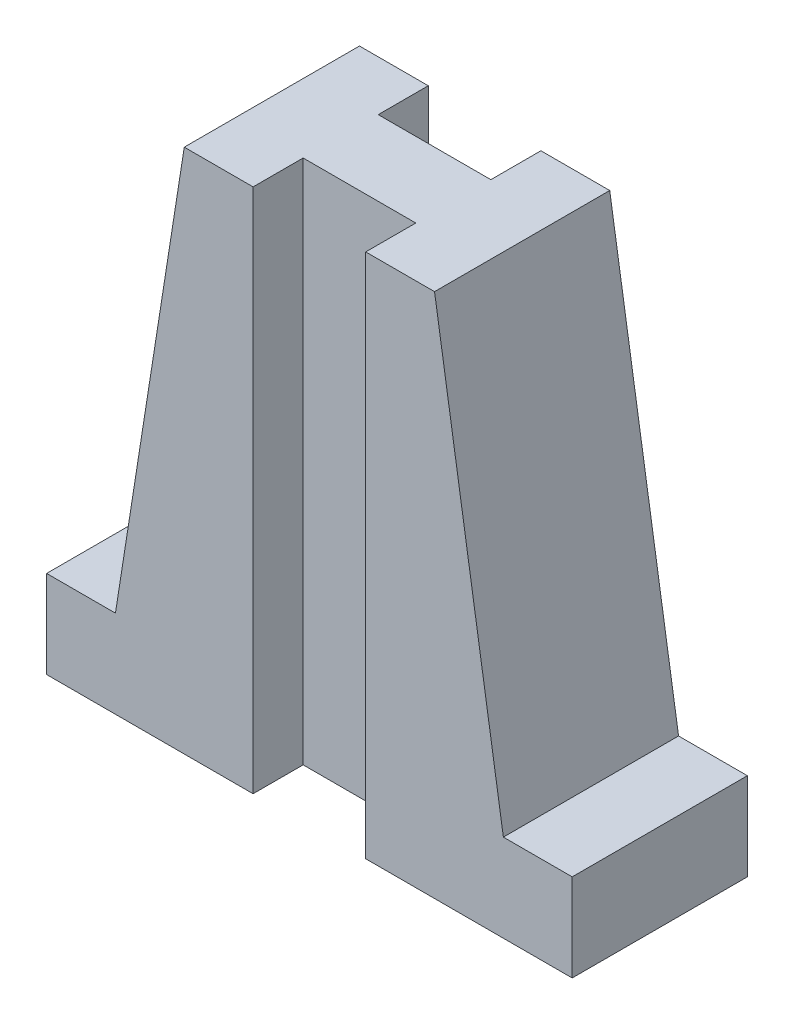
ISO-10303-21;
HEADER;
FILE_DESCRIPTION(('STEP AP214'),'2;1');
FILE_NAME('part.step','',(''),(''),'','','');
FILE_SCHEMA(('AUTOMOTIVE_DESIGN { 1 0 10303 214 1 1 1 1 }'));
ENDSEC;
DATA;
#1=APPLICATION_CONTEXT('core data for automotive mechanical design processes');
#2=APPLICATION_PROTOCOL_DEFINITION('international standard','automotive_design',2000,#1);
#3=PRODUCT_CONTEXT('',#1,'mechanical');
#4=PRODUCT('Part','Part','',(#3));
#5=PRODUCT_RELATED_PRODUCT_CATEGORY('part','',(#4));
#6=PRODUCT_DEFINITION_FORMATION('','',#4);
#7=PRODUCT_DEFINITION_CONTEXT('part definition',#1,'design');
#8=PRODUCT_DEFINITION('design','',#6,#7);
#9=PRODUCT_DEFINITION_SHAPE('','',#8);
#10=(LENGTH_UNIT() NAMED_UNIT(*) SI_UNIT(.MILLI.,.METRE.));
#11=(NAMED_UNIT(*) PLANE_ANGLE_UNIT() SI_UNIT($,.RADIAN.));
#12=(NAMED_UNIT(*) SI_UNIT($,.STERADIAN.) SOLID_ANGLE_UNIT());
#13=UNCERTAINTY_MEASURE_WITH_UNIT(LENGTH_MEASURE(1.E-05),#10,'distance_accuracy_value','');
#14=(GEOMETRIC_REPRESENTATION_CONTEXT(3) GLOBAL_UNCERTAINTY_ASSIGNED_CONTEXT((#13)) GLOBAL_UNIT_ASSIGNED_CONTEXT((#10,
#11,#12)) REPRESENTATION_CONTEXT('',''));
#15=CARTESIAN_POINT('',(0.,0.,0.));
#16=DIRECTION('',(0.,0.,1.));
#17=DIRECTION('',(1.,0.,0.));
#18=AXIS2_PLACEMENT_3D('',#15,#16,#17);
#19=CARTESIAN_POINT('',(0.,0.,-28.));
#20=DIRECTION('',(0.,0.,1.));
#21=DIRECTION('',(1.,0.,0.));
#22=AXIS2_PLACEMENT_3D('',#19,#20,#21);
#23=PLANE('',#22);
#24=DIRECTION('',(-1.,0.,0.));
#25=VECTOR('',#24,1.);
#26=CARTESIAN_POINT('',(-20.,35.,-28.));
#27=LINE('',#26,#25);
#28=CARTESIAN_POINT('',(-9.00000000000001,35.,-28.));
#29=VERTEX_POINT('',#28);
#30=CARTESIAN_POINT('',(-20.,35.,-28.));
#31=VERTEX_POINT('',#30);
#32=EDGE_CURVE('E231',#29,#31,#27,.T.);
#33=ORIENTED_EDGE('',*,*,#32,.F.);
#34=DIRECTION('',(0.,1.,0.));
#35=VECTOR('',#34,1.);
#36=CARTESIAN_POINT('',(-8.99999999999999,-49.,-28.));
#37=LINE('',#36,#35);
#38=CARTESIAN_POINT('',(-8.99999999999999,-49.,-28.));
#39=VERTEX_POINT('',#38);
#40=EDGE_CURVE('E265',#39,#29,#37,.T.);
#41=ORIENTED_EDGE('',*,*,#40,.F.);
#42=DIRECTION('',(1.,0.,0.));
#43=VECTOR('',#42,1.);
#44=CARTESIAN_POINT('',(-42.,-49.,-28.));
#45=LINE('',#44,#43);
#46=CARTESIAN_POINT('',(-42.,-49.,-28.));
#47=VERTEX_POINT('',#46);
#48=EDGE_CURVE('E241',#47,#39,#45,.T.);
#49=ORIENTED_EDGE('',*,*,#48,.F.);
#50=DIRECTION('',(0.,-1.,0.));
#51=VECTOR('',#50,1.);
#52=CARTESIAN_POINT('',(-42.,-35.,-28.));
#53=LINE('',#52,#51);
#54=CARTESIAN_POINT('',(-42.,-35.,-28.));
#55=VERTEX_POINT('',#54);
#56=EDGE_CURVE('E202',#55,#47,#53,.T.);
#57=ORIENTED_EDGE('',*,*,#56,.F.);
#58=DIRECTION('',(-1.,0.,0.));
#59=VECTOR('',#58,1.);
#60=CARTESIAN_POINT('',(-42.,-35.,-28.));
#61=LINE('',#60,#59);
#62=CARTESIAN_POINT('',(-31.,-35.,-28.));
#63=VERTEX_POINT('',#62);
#64=EDGE_CURVE('E218',#63,#55,#61,.T.);
#65=ORIENTED_EDGE('',*,*,#64,.F.);
#66=DIRECTION('',(-0.155237833992133,-0.987877125404486,0.));
#67=VECTOR('',#66,1.);
#68=CARTESIAN_POINT('',(-31.,-35.,-28.));
#69=LINE('',#68,#67);
#70=EDGE_CURVE('E222',#31,#63,#69,.T.);
#71=ORIENTED_EDGE('',*,*,#70,.F.);
#72=EDGE_LOOP('',(#33,#41,#49,#57,#65,#71));
#73=FACE_BOUND('',#72,.T.);
#74=ADVANCED_FACE('F41',(#73),#23,.F.);
#75=CARTESIAN_POINT('',(0.,0.,0.));
#76=DIRECTION('',(0.,0.,1.));
#77=DIRECTION('',(1.,0.,0.));
#78=AXIS2_PLACEMENT_3D('',#75,#76,#77);
#79=PLANE('',#78);
#80=DIRECTION('',(0.,1.,0.));
#81=VECTOR('',#80,1.);
#82=CARTESIAN_POINT('',(-8.99999999999999,-49.,0.));
#83=LINE('',#82,#81);
#84=CARTESIAN_POINT('',(-8.99999999999999,-49.,0.));
#85=VERTEX_POINT('',#84);
#86=CARTESIAN_POINT('',(-9.00000000000001,35.,0.));
#87=VERTEX_POINT('',#86);
#88=EDGE_CURVE('E155',#85,#87,#83,.T.);
#89=ORIENTED_EDGE('',*,*,#88,.T.);
#90=DIRECTION('',(-1.,0.,0.));
#91=VECTOR('',#90,1.);
#92=CARTESIAN_POINT('',(-20.,35.,0.));
#93=LINE('',#92,#91);
#94=CARTESIAN_POINT('',(-20.,35.,0.));
#95=VERTEX_POINT('',#94);
#96=EDGE_CURVE('E194',#87,#95,#93,.T.);
#97=ORIENTED_EDGE('',*,*,#96,.T.);
#98=DIRECTION('',(-0.155237833992133,-0.987877125404486,0.));
#99=VECTOR('',#98,1.);
#100=CARTESIAN_POINT('',(-31.,-35.,0.));
#101=LINE('',#100,#99);
#102=CARTESIAN_POINT('',(-31.,-35.,0.));
#103=VERTEX_POINT('',#102);
#104=EDGE_CURVE('E198',#95,#103,#101,.T.);
#105=ORIENTED_EDGE('',*,*,#104,.T.);
#106=DIRECTION('',(-1.,0.,0.));
#107=VECTOR('',#106,1.);
#108=CARTESIAN_POINT('',(-42.,-35.,0.));
#109=LINE('',#108,#107);
#110=CARTESIAN_POINT('',(-42.,-35.,0.));
#111=VERTEX_POINT('',#110);
#112=EDGE_CURVE('E201',#103,#111,#109,.T.);
#113=ORIENTED_EDGE('',*,*,#112,.T.);
#114=DIRECTION('',(0.,-1.,0.));
#115=VECTOR('',#114,1.);
#116=CARTESIAN_POINT('',(-42.,-35.,0.));
#117=LINE('',#116,#115);
#118=CARTESIAN_POINT('',(-42.,-49.,0.));
#119=VERTEX_POINT('',#118);
#120=EDGE_CURVE('E179',#111,#119,#117,.T.);
#121=ORIENTED_EDGE('',*,*,#120,.T.);
#122=DIRECTION('',(1.,0.,0.));
#123=VECTOR('',#122,1.);
#124=CARTESIAN_POINT('',(-42.,-49.,0.));
#125=LINE('',#124,#123);
#126=EDGE_CURVE('E171',#119,#85,#125,.T.);
#127=ORIENTED_EDGE('',*,*,#126,.T.);
#128=EDGE_LOOP('',(#89,#97,#105,#113,#121,#127));
#129=FACE_BOUND('',#128,.T.);
#130=ADVANCED_FACE('F176',(#129),#79,.T.);
#131=CARTESIAN_POINT('',(-42.,-35.,-28.));
#132=DIRECTION('',(-1.,0.,0.));
#133=DIRECTION('',(0.,-1.,0.));
#134=AXIS2_PLACEMENT_3D('',#131,#132,#133);
#135=PLANE('',#134);
#136=ORIENTED_EDGE('',*,*,#120,.F.);
#137=DIRECTION('',(0.,0.,1.));
#138=VECTOR('',#137,1.);
#139=CARTESIAN_POINT('',(-42.,-35.,-28.));
#140=LINE('',#139,#138);
#141=EDGE_CURVE('E11',#55,#111,#140,.T.);
#142=ORIENTED_EDGE('',*,*,#141,.F.);
#143=ORIENTED_EDGE('',*,*,#56,.T.);
#144=DIRECTION('',(0.,0.,1.));
#145=VECTOR('',#144,1.);
#146=CARTESIAN_POINT('',(-42.,-49.,-28.));
#147=LINE('',#146,#145);
#148=EDGE_CURVE('E45',#47,#119,#147,.T.);
#149=ORIENTED_EDGE('',*,*,#148,.T.);
#150=EDGE_LOOP('',(#136,#142,#143,#149));
#151=FACE_BOUND('',#150,.T.);
#152=ADVANCED_FACE('F43',(#151),#135,.T.);
#153=CARTESIAN_POINT('',(-42.,-35.,-28.));
#154=DIRECTION('',(0.,1.,0.));
#155=DIRECTION('',(-1.,0.,0.));
#156=AXIS2_PLACEMENT_3D('',#153,#154,#155);
#157=PLANE('',#156);
#158=ORIENTED_EDGE('',*,*,#112,.F.);
#159=DIRECTION('',(0.,0.,1.));
#160=VECTOR('',#159,1.);
#161=CARTESIAN_POINT('',(-31.,-35.,-28.));
#162=LINE('',#161,#160);
#163=EDGE_CURVE('E50',#63,#103,#162,.T.);
#164=ORIENTED_EDGE('',*,*,#163,.F.);
#165=ORIENTED_EDGE('',*,*,#64,.T.);
#166=ORIENTED_EDGE('',*,*,#141,.T.);
#167=EDGE_LOOP('',(#158,#164,#165,#166));
#168=FACE_BOUND('',#167,.T.);
#169=ADVANCED_FACE('F346',(#168),#157,.T.);
#170=CARTESIAN_POINT('',(-31.,-35.,-28.));
#171=DIRECTION('',(-0.987877125404486,0.155237833992133,0.));
#172=DIRECTION('',(-0.155237833992133,-0.987877125404486,0.));
#173=AXIS2_PLACEMENT_3D('',#170,#171,#172);
#174=PLANE('',#173);
#175=ORIENTED_EDGE('',*,*,#104,.F.);
#176=DIRECTION('',(0.,0.,1.));
#177=VECTOR('',#176,1.);
#178=CARTESIAN_POINT('',(-20.,35.,-28.));
#179=LINE('',#178,#177);
#180=EDGE_CURVE('E205',#31,#95,#179,.T.);
#181=ORIENTED_EDGE('',*,*,#180,.F.);
#182=ORIENTED_EDGE('',*,*,#70,.T.);
#183=ORIENTED_EDGE('',*,*,#163,.T.);
#184=EDGE_LOOP('',(#175,#181,#182,#183));
#185=FACE_BOUND('',#184,.T.);
#186=ADVANCED_FACE('F344',(#185),#174,.T.);
#187=CARTESIAN_POINT('',(-20.,35.,-28.));
#188=DIRECTION('',(0.,1.,0.));
#189=DIRECTION('',(-1.,0.,0.));
#190=AXIS2_PLACEMENT_3D('',#187,#188,#189);
#191=PLANE('',#190);
#192=DIRECTION('',(0.,0.,1.));
#193=VECTOR('',#192,1.);
#194=CARTESIAN_POINT('',(-9.00000000000001,35.,-8.));
#195=LINE('',#194,#193);
#196=CARTESIAN_POINT('',(-9.00000000000001,35.,-8.));
#197=VERTEX_POINT('',#196);
#198=EDGE_CURVE('E161',#197,#87,#195,.T.);
#199=ORIENTED_EDGE('',*,*,#198,.F.);
#200=DIRECTION('',(-1.,0.,0.));
#201=VECTOR('',#200,1.);
#202=CARTESIAN_POINT('',(-9.00000000000001,35.,-8.));
#203=LINE('',#202,#201);
#204=CARTESIAN_POINT('',(8.99999999999999,35.,-8.));
#205=VERTEX_POINT('',#204);
#206=EDGE_CURVE('E174',#205,#197,#203,.T.);
#207=ORIENTED_EDGE('',*,*,#206,.F.);
#208=DIRECTION('',(0.,0.,-1.));
#209=VECTOR('',#208,1.);
#210=CARTESIAN_POINT('',(8.99999999999999,35.,-8.));
#211=LINE('',#210,#209);
#212=CARTESIAN_POINT('',(8.99999999999999,35.,0.));
#213=VERTEX_POINT('',#212);
#214=EDGE_CURVE('E277',#213,#205,#211,.T.);
#215=ORIENTED_EDGE('',*,*,#214,.F.);
#216=CARTESIAN_POINT('',(20.,35.,0.));
#217=VERTEX_POINT('',#216);
#218=EDGE_CURVE('E195',#217,#213,#93,.T.);
#219=ORIENTED_EDGE('',*,*,#218,.F.);
#220=DIRECTION('',(0.,0.,1.));
#221=VECTOR('',#220,1.);
#222=CARTESIAN_POINT('',(20.,35.,-28.));
#223=LINE('',#222,#221);
#224=CARTESIAN_POINT('',(20.,35.,-28.));
#225=VERTEX_POINT('',#224);
#226=EDGE_CURVE('E208',#225,#217,#223,.T.);
#227=ORIENTED_EDGE('',*,*,#226,.F.);
#228=CARTESIAN_POINT('',(8.99999999999999,35.,-28.));
#229=VERTEX_POINT('',#228);
#230=EDGE_CURVE('E226',#225,#229,#27,.T.);
#231=ORIENTED_EDGE('',*,*,#230,.T.);
#232=DIRECTION('',(0.,0.,-1.));
#233=VECTOR('',#232,1.);
#234=CARTESIAN_POINT('',(8.99999999999999,35.,-20.));
#235=LINE('',#234,#233);
#236=CARTESIAN_POINT('',(8.99999999999999,35.,-20.));
#237=VERTEX_POINT('',#236);
#238=EDGE_CURVE('E58',#237,#229,#235,.T.);
#239=ORIENTED_EDGE('',*,*,#238,.F.);
#240=DIRECTION('',(1.,0.,0.));
#241=VECTOR('',#240,1.);
#242=CARTESIAN_POINT('',(-9.00000000000001,35.,-20.));
#243=LINE('',#242,#241);
#244=CARTESIAN_POINT('',(-9.00000000000001,35.,-20.));
#245=VERTEX_POINT('',#244);
#246=EDGE_CURVE('E257',#245,#237,#243,.T.);
#247=ORIENTED_EDGE('',*,*,#246,.F.);
#248=DIRECTION('',(0.,0.,1.));
#249=VECTOR('',#248,1.);
#250=CARTESIAN_POINT('',(-9.00000000000001,35.,-20.));
#251=LINE('',#250,#249);
#252=EDGE_CURVE('E249',#29,#245,#251,.T.);
#253=ORIENTED_EDGE('',*,*,#252,.F.);
#254=ORIENTED_EDGE('',*,*,#32,.T.);
#255=ORIENTED_EDGE('',*,*,#180,.T.);
#256=ORIENTED_EDGE('',*,*,#96,.F.);
#257=EDGE_LOOP('',(#199,#207,#215,#219,#227,#231,#239,#247,#253,#254,#255,#256));
#258=FACE_BOUND('',#257,.T.);
#259=ADVANCED_FACE('F289',(#258),#191,.T.);
#260=CARTESIAN_POINT('',(20.,35.,-28.));
#261=DIRECTION('',(0.987877125404486,0.155237833992134,0.));
#262=DIRECTION('',(-0.155237833992134,0.987877125404486,0.));
#263=AXIS2_PLACEMENT_3D('',#260,#261,#262);
#264=PLANE('',#263);
#265=DIRECTION('',(-0.155237833992134,0.987877125404486,0.));
#266=VECTOR('',#265,1.);
#267=CARTESIAN_POINT('',(20.,35.,0.));
#268=LINE('',#267,#266);
#269=CARTESIAN_POINT('',(31.,-35.,0.));
#270=VERTEX_POINT('',#269);
#271=EDGE_CURVE('E191',#270,#217,#268,.T.);
#272=ORIENTED_EDGE('',*,*,#271,.F.);
#273=DIRECTION('',(0.,0.,1.));
#274=VECTOR('',#273,1.);
#275=CARTESIAN_POINT('',(31.,-35.,-28.));
#276=LINE('',#275,#274);
#277=CARTESIAN_POINT('',(31.,-35.,-28.));
#278=VERTEX_POINT('',#277);
#279=EDGE_CURVE('E210',#278,#270,#276,.T.);
#280=ORIENTED_EDGE('',*,*,#279,.F.);
#281=DIRECTION('',(-0.155237833992134,0.987877125404486,0.));
#282=VECTOR('',#281,1.);
#283=CARTESIAN_POINT('',(20.,35.,-28.));
#284=LINE('',#283,#282);
#285=EDGE_CURVE('E232',#278,#225,#284,.T.);
#286=ORIENTED_EDGE('',*,*,#285,.T.);
#287=ORIENTED_EDGE('',*,*,#226,.T.);
#288=EDGE_LOOP('',(#272,#280,#286,#287));
#289=FACE_BOUND('',#288,.T.);
#290=ADVANCED_FACE('F329',(#289),#264,.T.);
#291=CARTESIAN_POINT('',(31.,-35.,-28.));
#292=DIRECTION('',(0.,1.,0.));
#293=DIRECTION('',(-1.,0.,0.));
#294=AXIS2_PLACEMENT_3D('',#291,#292,#293);
#295=PLANE('',#294);
#296=DIRECTION('',(-1.,0.,0.));
#297=VECTOR('',#296,1.);
#298=CARTESIAN_POINT('',(31.,-35.,0.));
#299=LINE('',#298,#297);
#300=CARTESIAN_POINT('',(42.,-35.,0.));
#301=VERTEX_POINT('',#300);
#302=EDGE_CURVE('E184',#301,#270,#299,.T.);
#303=ORIENTED_EDGE('',*,*,#302,.F.);
#304=DIRECTION('',(0.,0.,1.));
#305=VECTOR('',#304,1.);
#306=CARTESIAN_POINT('',(42.,-35.,-28.));
#307=LINE('',#306,#305);
#308=CARTESIAN_POINT('',(42.,-35.,-28.));
#309=VERTEX_POINT('',#308);
#310=EDGE_CURVE('E212',#309,#301,#307,.T.);
#311=ORIENTED_EDGE('',*,*,#310,.F.);
#312=DIRECTION('',(-1.,0.,0.));
#313=VECTOR('',#312,1.);
#314=CARTESIAN_POINT('',(31.,-35.,-28.));
#315=LINE('',#314,#313);
#316=EDGE_CURVE('E235',#309,#278,#315,.T.);
#317=ORIENTED_EDGE('',*,*,#316,.T.);
#318=ORIENTED_EDGE('',*,*,#279,.T.);
#319=EDGE_LOOP('',(#303,#311,#317,#318));
#320=FACE_BOUND('',#319,.T.);
#321=ADVANCED_FACE('F326',(#320),#295,.T.);
#322=CARTESIAN_POINT('',(42.,-35.,-28.));
#323=DIRECTION('',(1.,0.,0.));
#324=DIRECTION('',(0.,0.,-1.));
#325=AXIS2_PLACEMENT_3D('',#322,#323,#324);
#326=PLANE('',#325);
#327=DIRECTION('',(0.,1.,0.));
#328=VECTOR('',#327,1.);
#329=CARTESIAN_POINT('',(42.,-35.,0.));
#330=LINE('',#329,#328);
#331=CARTESIAN_POINT('',(42.,-49.,0.));
#332=VERTEX_POINT('',#331);
#333=EDGE_CURVE('E180',#332,#301,#330,.T.);
#334=ORIENTED_EDGE('',*,*,#333,.F.);
#335=DIRECTION('',(0.,0.,1.));
#336=VECTOR('',#335,1.);
#337=CARTESIAN_POINT('',(42.,-49.,-28.));
#338=LINE('',#337,#336);
#339=CARTESIAN_POINT('',(42.,-49.,-28.));
#340=VERTEX_POINT('',#339);
#341=EDGE_CURVE('E213',#340,#332,#338,.T.);
#342=ORIENTED_EDGE('',*,*,#341,.F.);
#343=DIRECTION('',(0.,1.,0.));
#344=VECTOR('',#343,1.);
#345=CARTESIAN_POINT('',(42.,-35.,-28.));
#346=LINE('',#345,#344);
#347=EDGE_CURVE('E238',#340,#309,#346,.T.);
#348=ORIENTED_EDGE('',*,*,#347,.T.);
#349=ORIENTED_EDGE('',*,*,#310,.T.);
#350=EDGE_LOOP('',(#334,#342,#348,#349));
#351=FACE_BOUND('',#350,.T.);
#352=ADVANCED_FACE('F317',(#351),#326,.T.);
#353=CARTESIAN_POINT('',(-42.,-49.,-28.));
#354=DIRECTION('',(0.,-1.,0.));
#355=DIRECTION('',(1.,0.,0.));
#356=AXIS2_PLACEMENT_3D('',#353,#354,#355);
#357=PLANE('',#356);
#358=DIRECTION('',(0.,0.,1.));
#359=VECTOR('',#358,1.);
#360=CARTESIAN_POINT('',(-8.99999999999999,-49.,-8.));
#361=LINE('',#360,#359);
#362=CARTESIAN_POINT('',(-8.99999999999999,-49.,-8.));
#363=VERTEX_POINT('',#362);
#364=EDGE_CURVE('E158',#363,#85,#361,.T.);
#365=ORIENTED_EDGE('',*,*,#364,.T.);
#366=ORIENTED_EDGE('',*,*,#126,.F.);
#367=ORIENTED_EDGE('',*,*,#148,.F.);
#368=ORIENTED_EDGE('',*,*,#48,.T.);
#369=DIRECTION('',(0.,0.,1.));
#370=VECTOR('',#369,1.);
#371=CARTESIAN_POINT('',(-9.,-49.,-20.));
#372=LINE('',#371,#370);
#373=CARTESIAN_POINT('',(-9.,-49.,-20.));
#374=VERTEX_POINT('',#373);
#375=EDGE_CURVE('E253',#39,#374,#372,.T.);
#376=ORIENTED_EDGE('',*,*,#375,.T.);
#377=DIRECTION('',(1.,0.,0.));
#378=VECTOR('',#377,1.);
#379=CARTESIAN_POINT('',(-9.,-49.,-20.));
#380=LINE('',#379,#378);
#381=CARTESIAN_POINT('',(9.00000000000001,-49.,-20.));
#382=VERTEX_POINT('',#381);
#383=EDGE_CURVE('E246',#374,#382,#380,.T.);
#384=ORIENTED_EDGE('',*,*,#383,.T.);
#385=DIRECTION('',(0.,0.,-1.));
#386=VECTOR('',#385,1.);
#387=CARTESIAN_POINT('',(9.00000000000001,-49.,-20.));
#388=LINE('',#387,#386);
#389=CARTESIAN_POINT('',(9.00000000000001,-49.,-28.));
#390=VERTEX_POINT('',#389);
#391=EDGE_CURVE('E250',#382,#390,#388,.T.);
#392=ORIENTED_EDGE('',*,*,#391,.T.);
#393=EDGE_CURVE('E244',#390,#340,#45,.T.);
#394=ORIENTED_EDGE('',*,*,#393,.T.);
#395=ORIENTED_EDGE('',*,*,#341,.T.);
#396=CARTESIAN_POINT('',(9.00000000000001,-49.,0.));
#397=VERTEX_POINT('',#396);
#398=EDGE_CURVE('E181',#397,#332,#125,.T.);
#399=ORIENTED_EDGE('',*,*,#398,.F.);
#400=DIRECTION('',(0.,0.,-1.));
#401=VECTOR('',#400,1.);
#402=CARTESIAN_POINT('',(9.00000000000001,-49.,-8.));
#403=LINE('',#402,#401);
#404=CARTESIAN_POINT('',(9.00000000000001,-49.,-8.));
#405=VERTEX_POINT('',#404);
#406=EDGE_CURVE('E66',#397,#405,#403,.T.);
#407=ORIENTED_EDGE('',*,*,#406,.T.);
#408=DIRECTION('',(-1.,0.,0.));
#409=VECTOR('',#408,1.);
#410=CARTESIAN_POINT('',(-8.99999999999999,-49.,-8.));
#411=LINE('',#410,#409);
#412=EDGE_CURVE('E166',#405,#363,#411,.T.);
#413=ORIENTED_EDGE('',*,*,#412,.T.);
#414=EDGE_LOOP('',(#365,#366,#367,#368,#376,#384,#392,#394,#395,#399,#407,#413));
#415=FACE_BOUND('',#414,.T.);
#416=ADVANCED_FACE('F170',(#415),#357,.T.);
#417=ORIENTED_EDGE('',*,*,#393,.F.);
#418=DIRECTION('',(0.,1.,0.));
#419=VECTOR('',#418,1.);
#420=CARTESIAN_POINT('',(9.00000000000001,-49.,-28.));
#421=LINE('',#420,#419);
#422=EDGE_CURVE('E267',#390,#229,#421,.T.);
#423=ORIENTED_EDGE('',*,*,#422,.T.);
#424=ORIENTED_EDGE('',*,*,#230,.F.);
#425=ORIENTED_EDGE('',*,*,#285,.F.);
#426=ORIENTED_EDGE('',*,*,#316,.F.);
#427=ORIENTED_EDGE('',*,*,#347,.F.);
#428=EDGE_LOOP('',(#417,#423,#424,#425,#426,#427));
#429=FACE_BOUND('',#428,.T.);
#430=ADVANCED_FACE('F304',(#429),#23,.F.);
#431=DIRECTION('',(0.,1.,0.));
#432=VECTOR('',#431,1.);
#433=CARTESIAN_POINT('',(9.00000000000001,-49.,0.));
#434=LINE('',#433,#432);
#435=EDGE_CURVE('E165',#397,#213,#434,.T.);
#436=ORIENTED_EDGE('',*,*,#435,.F.);
#437=ORIENTED_EDGE('',*,*,#398,.T.);
#438=ORIENTED_EDGE('',*,*,#333,.T.);
#439=ORIENTED_EDGE('',*,*,#302,.T.);
#440=ORIENTED_EDGE('',*,*,#271,.T.);
#441=ORIENTED_EDGE('',*,*,#218,.T.);
#442=EDGE_LOOP('',(#436,#437,#438,#439,#440,#441));
#443=FACE_BOUND('',#442,.T.);
#444=ADVANCED_FACE('F283',(#443),#79,.T.);
#445=CARTESIAN_POINT('',(-8.99999999999999,-49.,-8.));
#446=DIRECTION('',(-1.,0.,0.));
#447=DIRECTION('',(0.,0.,1.));
#448=AXIS2_PLACEMENT_3D('',#445,#446,#447);
#449=PLANE('',#448);
#450=ORIENTED_EDGE('',*,*,#198,.T.);
#451=ORIENTED_EDGE('',*,*,#88,.F.);
#452=ORIENTED_EDGE('',*,*,#364,.F.);
#453=DIRECTION('',(0.,1.,0.));
#454=VECTOR('',#453,1.);
#455=CARTESIAN_POINT('',(-8.99999999999999,-49.,-8.));
#456=LINE('',#455,#454);
#457=EDGE_CURVE('E273',#363,#197,#456,.T.);
#458=ORIENTED_EDGE('',*,*,#457,.T.);
#459=EDGE_LOOP('',(#450,#451,#452,#458));
#460=FACE_BOUND('',#459,.T.);
#461=ADVANCED_FACE('F157',(#460),#449,.F.);
#462=CARTESIAN_POINT('',(-8.99999999999999,-49.,-8.));
#463=DIRECTION('',(0.,0.,-1.));
#464=DIRECTION('',(-1.,0.,0.));
#465=AXIS2_PLACEMENT_3D('',#462,#463,#464);
#466=PLANE('',#465);
#467=ORIENTED_EDGE('',*,*,#206,.T.);
#468=ORIENTED_EDGE('',*,*,#457,.F.);
#469=ORIENTED_EDGE('',*,*,#412,.F.);
#470=DIRECTION('',(0.,1.,0.));
#471=VECTOR('',#470,1.);
#472=CARTESIAN_POINT('',(9.00000000000001,-49.,-8.));
#473=LINE('',#472,#471);
#474=EDGE_CURVE('E271',#405,#205,#473,.T.);
#475=ORIENTED_EDGE('',*,*,#474,.T.);
#476=EDGE_LOOP('',(#467,#468,#469,#475));
#477=FACE_BOUND('',#476,.T.);
#478=ADVANCED_FACE('F291',(#477),#466,.F.);
#479=CARTESIAN_POINT('',(9.00000000000001,-49.,-8.));
#480=DIRECTION('',(1.,0.,0.));
#481=DIRECTION('',(0.,0.,-1.));
#482=AXIS2_PLACEMENT_3D('',#479,#480,#481);
#483=PLANE('',#482);
#484=ORIENTED_EDGE('',*,*,#214,.T.);
#485=ORIENTED_EDGE('',*,*,#474,.F.);
#486=ORIENTED_EDGE('',*,*,#406,.F.);
#487=ORIENTED_EDGE('',*,*,#435,.T.);
#488=EDGE_LOOP('',(#484,#485,#486,#487));
#489=FACE_BOUND('',#488,.T.);
#490=ADVANCED_FACE('F286',(#489),#483,.F.);
#491=CARTESIAN_POINT('',(-9.,-49.,-20.));
#492=DIRECTION('',(0.,0.,1.));
#493=DIRECTION('',(1.,0.,0.));
#494=AXIS2_PLACEMENT_3D('',#491,#492,#493);
#495=PLANE('',#494);
#496=ORIENTED_EDGE('',*,*,#246,.T.);
#497=DIRECTION('',(0.,1.,0.));
#498=VECTOR('',#497,1.);
#499=CARTESIAN_POINT('',(9.00000000000001,-49.,-20.));
#500=LINE('',#499,#498);
#501=EDGE_CURVE('E256',#382,#237,#500,.T.);
#502=ORIENTED_EDGE('',*,*,#501,.F.);
#503=ORIENTED_EDGE('',*,*,#383,.F.);
#504=DIRECTION('',(0.,1.,0.));
#505=VECTOR('',#504,1.);
#506=CARTESIAN_POINT('',(-9.,-49.,-20.));
#507=LINE('',#506,#505);
#508=EDGE_CURVE('E263',#374,#245,#507,.T.);
#509=ORIENTED_EDGE('',*,*,#508,.T.);
#510=EDGE_LOOP('',(#496,#502,#503,#509));
#511=FACE_BOUND('',#510,.T.);
#512=ADVANCED_FACE('F298',(#511),#495,.F.);
#513=CARTESIAN_POINT('',(-9.,-49.,-20.));
#514=DIRECTION('',(-1.,0.,0.));
#515=DIRECTION('',(0.,0.,1.));
#516=AXIS2_PLACEMENT_3D('',#513,#514,#515);
#517=PLANE('',#516);
#518=ORIENTED_EDGE('',*,*,#252,.T.);
#519=ORIENTED_EDGE('',*,*,#508,.F.);
#520=ORIENTED_EDGE('',*,*,#375,.F.);
#521=ORIENTED_EDGE('',*,*,#40,.T.);
#522=EDGE_LOOP('',(#518,#519,#520,#521));
#523=FACE_BOUND('',#522,.T.);
#524=ADVANCED_FACE('F336',(#523),#517,.F.);
#525=CARTESIAN_POINT('',(9.00000000000001,-49.,-20.));
#526=DIRECTION('',(1.,0.,0.));
#527=DIRECTION('',(0.,0.,-1.));
#528=AXIS2_PLACEMENT_3D('',#525,#526,#527);
#529=PLANE('',#528);
#530=ORIENTED_EDGE('',*,*,#238,.T.);
#531=ORIENTED_EDGE('',*,*,#422,.F.);
#532=ORIENTED_EDGE('',*,*,#391,.F.);
#533=ORIENTED_EDGE('',*,*,#501,.T.);
#534=EDGE_LOOP('',(#530,#531,#532,#533));
#535=FACE_BOUND('',#534,.T.);
#536=ADVANCED_FACE('F428',(#535),#529,.F.);
#537=CLOSED_SHELL('',(#74,#130,#152,#169,#186,#259,#290,#321,#352,#416,#430,#444,#461,#478,#490,
#512,#524,#536));
#538=MANIFOLD_SOLID_BREP('B2',#537);
#539=ADVANCED_BREP_SHAPE_REPRESENTATION('',(#18,#538),#14);
#540=SHAPE_DEFINITION_REPRESENTATION(#9,#539);
ENDSEC;
END-ISO-10303-21;
